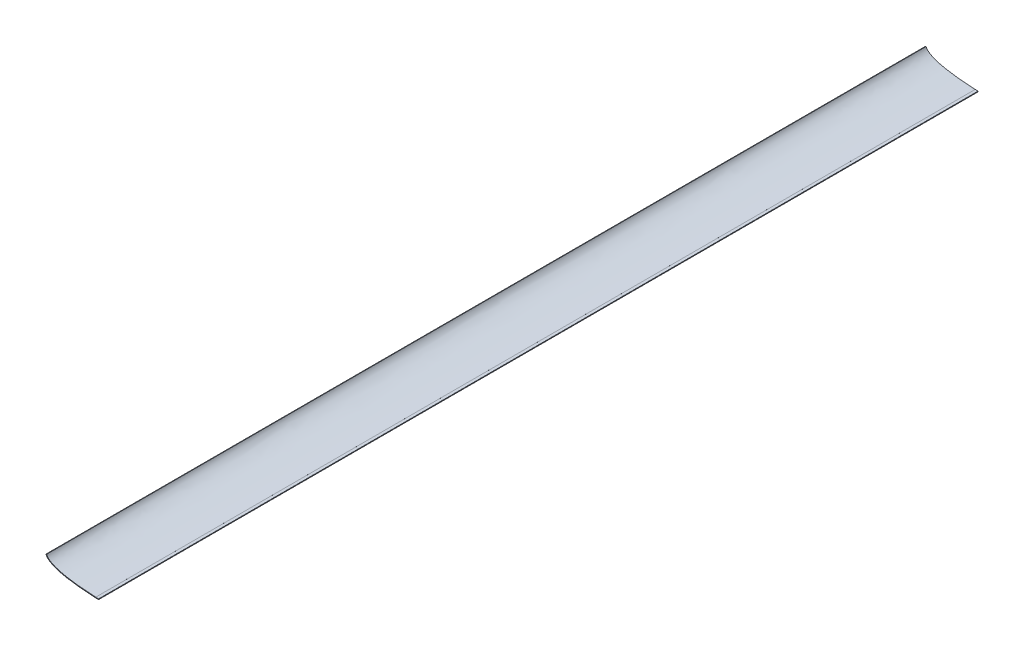
ISO-10303-21;
HEADER;
FILE_DESCRIPTION(('STEP AP214'),'2;1');
FILE_NAME('part.step','',(''),(''),'','','');
FILE_SCHEMA(('AUTOMOTIVE_DESIGN { 1 0 10303 214 1 1 1 1 }'));
ENDSEC;
DATA;
#1=APPLICATION_CONTEXT('core data for automotive mechanical design processes');
#2=APPLICATION_PROTOCOL_DEFINITION('international standard','automotive_design',2000,#1);
#3=PRODUCT_CONTEXT('',#1,'mechanical');
#4=PRODUCT('Part','Part','',(#3));
#5=PRODUCT_RELATED_PRODUCT_CATEGORY('part','',(#4));
#6=PRODUCT_DEFINITION_FORMATION('','',#4);
#7=PRODUCT_DEFINITION_CONTEXT('part definition',#1,'design');
#8=PRODUCT_DEFINITION('design','',#6,#7);
#9=PRODUCT_DEFINITION_SHAPE('','',#8);
#10=(LENGTH_UNIT() NAMED_UNIT(*) SI_UNIT(.MILLI.,.METRE.));
#11=(NAMED_UNIT(*) PLANE_ANGLE_UNIT() SI_UNIT($,.RADIAN.));
#12=(NAMED_UNIT(*) SI_UNIT($,.STERADIAN.) SOLID_ANGLE_UNIT());
#13=UNCERTAINTY_MEASURE_WITH_UNIT(LENGTH_MEASURE(1.E-05),#10,'distance_accuracy_value','');
#14=(GEOMETRIC_REPRESENTATION_CONTEXT(3) GLOBAL_UNCERTAINTY_ASSIGNED_CONTEXT((#13)) GLOBAL_UNIT_ASSIGNED_CONTEXT((#10,
#11,#12)) REPRESENTATION_CONTEXT('',''));
#15=CARTESIAN_POINT('',(0.,0.,0.));
#16=DIRECTION('',(0.,0.,1.));
#17=DIRECTION('',(1.,0.,0.));
#18=AXIS2_PLACEMENT_3D('',#15,#16,#17);
#19=CARTESIAN_POINT('',(26.901066711762,-13.11585791087,0.));
#20=DIRECTION('',(0.,0.,1.));
#21=DIRECTION('',(1.,0.,0.));
#22=AXIS2_PLACEMENT_3D('',#19,#20,#21);
#23=PLANE('',#22);
#24=CARTESIAN_POINT('',(56.8281896627183,-15.996979923149,0.));
#25=CARTESIAN_POINT('',(53.4352418951946,-15.8327666243732,0.));
#26=CARTESIAN_POINT('',(47.827179309116,-15.4960428215048,0.));
#27=CARTESIAN_POINT('',(40.0204840876464,-14.8295538969955,0.));
#28=CARTESIAN_POINT('',(33.4038481550831,-14.0959251929234,0.));
#29=CARTESIAN_POINT('',(26.8204123460112,-13.1515847277481,0.));
#30=CARTESIAN_POINT('',(20.2947429531198,-11.9223261466579,0.));
#31=CARTESIAN_POINT('',(14.9445491076174,-10.5640357120534,0.));
#32=CARTESIAN_POINT('',(10.7844340516035,-9.15547387302315,0.));
#33=CARTESIAN_POINT('',(7.7663363929576,-7.88301900907946,0.));
#34=CARTESIAN_POINT('',(4.92994728444026,-6.31128484880025,0.));
#35=CARTESIAN_POINT('',(2.44807749314516,-4.30917962920341,0.));
#36=CARTESIAN_POINT('',(1.33745783890302,-2.56838043336178,0.));
#37=CARTESIAN_POINT('',(1.0429747319706,-1.62013911102391,0.));
#38=CARTESIAN_POINT('',(1.03901578886977,-1.6072204312826,0.));
#39=B_SPLINE_CURVE_WITH_KNOTS('',3,(#24,#25,#26,#27,#28,#29,#30,#31,#32,#33,#34,#35,#36,#37,
#38),.UNSPECIFIED.,.F.,.F.,(4,1,1,1,1,1,1,1,1,1,1,1,4),(0.505092138152908,0.517594637437808,
0.525773848263812,0.533953059089816,0.54213226991582,0.550311480741824,0.558490691567828,
0.56258029698083,0.566669902393832,0.570759507806834,0.574849113219836,0.578938718632838,
0.578995146534428),.UNSPECIFIED.);
#40=CARTESIAN_POINT('',(56.8281896627183,-15.996979923149,0.));
#41=VERTEX_POINT('',#40);
#42=CARTESIAN_POINT('',(1.03901578886977,-1.6072204312826,0.));
#43=VERTEX_POINT('',#42);
#44=EDGE_CURVE('E128',#41,#43,#39,.T.);
#45=ORIENTED_EDGE('',*,*,#44,.T.);
#46=DIRECTION('',(0.956111972949269,0.293001527612154,0.));
#47=VECTOR('',#46,1.);
#48=CARTESIAN_POINT('',(0.280101910341285,-1.83979039382474,0.));
#49=LINE('',#48,#47);
#50=CARTESIAN_POINT('',(0.280101910341285,-1.83979039382474,0.));
#51=VERTEX_POINT('',#50);
#52=EDGE_CURVE('E135',#51,#43,#49,.T.);
#53=ORIENTED_EDGE('',*,*,#52,.F.);
#54=CARTESIAN_POINT('',(56.7898183340665,-16.7898019105065,0.));
#55=CARTESIAN_POINT('',(51.766773466418,-16.5466944935546,0.));
#56=CARTESIAN_POINT('',(46.7476503498991,-16.2194285761813,0.));
#57=CARTESIAN_POINT('',(39.2357092452721,-15.5326298672791,0.));
#58=CARTESIAN_POINT('',(36.7345746663049,-15.2703112761094,0.));
#59=CARTESIAN_POINT('',(31.7431822661219,-14.6582621007946,0.));
#60=CARTESIAN_POINT('',(29.2523333489485,-14.3090986336579,0.));
#61=CARTESIAN_POINT('',(24.2908656840406,-13.488857664956,0.));
#62=CARTESIAN_POINT('',(21.8197329091077,-13.0180777860044,0.));
#63=CARTESIAN_POINT('',(16.91682334248,-11.8956080347622,0.));
#64=CARTESIAN_POINT('',(14.4845557405809,-11.2433041380057,0.));
#65=CARTESIAN_POINT('',(10.9135244988008,-10.0252452596212,0.));
#66=CARTESIAN_POINT('',(9.7364023472666,-9.57864300481027,0.));
#67=CARTESIAN_POINT('',(7.4339497858248,-8.5652698916742,0.));
#68=CARTESIAN_POINT('',(6.30678685118068,-7.99998636813309,0.));
#69=CARTESIAN_POINT('',(4.69933607525968,-7.01153313153026,0.));
#70=CARTESIAN_POINT('',(4.17730914145971,-6.65905263558991,0.));
#71=CARTESIAN_POINT('',(3.17645369396348,-5.89195388211098,0.));
#72=CARTESIAN_POINT('',(2.69907744329415,-5.47751588616392,0.));
#73=CARTESIAN_POINT('',(1.82178595959564,-4.57191876992906,0.));
#74=CARTESIAN_POINT('',(1.42118699398269,-4.07988472946924,0.));
#75=CARTESIAN_POINT('',(0.743379493507723,-3.01749492012648,0.));
#76=CARTESIAN_POINT('',(0.465927735318547,-2.44617049563472,0.));
#77=CARTESIAN_POINT('',(0.280101910341281,-1.83979039382473,0.));
#78=B_SPLINE_CURVE_WITH_KNOTS('',3,(#54,#55,#56,#57,#58,#59,#60,#61,#62,#63,#64,#65,#66,#67,#68,
#69,#70,#71,#72,#73,#74,#75,#76,#77),.UNSPECIFIED.,.F.,.F.,(4,2,2,2,2,2,2,2,2,2,2,4),(0.,0.25,
0.375,0.5,0.625,0.75,0.8125,0.875,0.90625,0.9375,0.96875,1.),.UNSPECIFIED.);
#79=CARTESIAN_POINT('',(56.7898183340665,-16.7898019105065,0.));
#80=VERTEX_POINT('',#79);
#81=EDGE_CURVE('E138',#80,#51,#78,.T.);
#82=ORIENTED_EDGE('',*,*,#81,.F.);
#83=DIRECTION('',(-0.048341831372306,-0.998830850214175,0.));
#84=VECTOR('',#83,1.);
#85=CARTESIAN_POINT('',(56.8281896627183,-15.996979923149,0.));
#86=LINE('',#85,#84);
#87=EDGE_CURVE('E127',#41,#80,#86,.T.);
#88=ORIENTED_EDGE('',*,*,#87,.F.);
#89=EDGE_LOOP('',(#45,#53,#82,#88));
#90=FACE_BOUND('',#89,.T.);
#91=ADVANCED_FACE('F81',(#90),#23,.T.);
#92=CARTESIAN_POINT('',(0.280101910341285,-1.83979039382474,-1058.55080707235));
#93=DIRECTION('',(0.293001527612154,-0.956111972949269,0.));
#94=DIRECTION('',(0.956111972949269,0.293001527612154,0.));
#95=AXIS2_PLACEMENT_3D('',#92,#93,#94);
#96=PLANE('',#95);
#97=DIRECTION('',(0.,0.,1.));
#98=VECTOR('',#97,1.);
#99=CARTESIAN_POINT('',(1.03901578886977,-1.6072204312826,-1058.55080707235));
#100=LINE('',#99,#98);
#101=CARTESIAN_POINT('',(1.03901578886977,-1.6072204312826,-1000.));
#102=VERTEX_POINT('',#101);
#103=EDGE_CURVE('E121',#102,#43,#100,.T.);
#104=ORIENTED_EDGE('',*,*,#103,.F.);
#105=DIRECTION('',(-0.956111972949269,-0.293001527612154,0.));
#106=VECTOR('',#105,1.);
#107=CARTESIAN_POINT('',(0.280101910341285,-1.83979039382474,-1000.));
#108=LINE('',#107,#106);
#109=CARTESIAN_POINT('',(0.280101910341285,-1.83979039382474,-1000.));
#110=VERTEX_POINT('',#109);
#111=EDGE_CURVE('E88',#102,#110,#108,.T.);
#112=ORIENTED_EDGE('',*,*,#111,.T.);
#113=DIRECTION('',(0.,0.,1.));
#114=VECTOR('',#113,1.);
#115=CARTESIAN_POINT('',(0.280101910341285,-1.83979039382474,-1058.55080707235));
#116=LINE('',#115,#114);
#117=EDGE_CURVE('E129',#110,#51,#116,.T.);
#118=ORIENTED_EDGE('',*,*,#117,.T.);
#119=ORIENTED_EDGE('',*,*,#52,.T.);
#120=EDGE_LOOP('',(#104,#112,#118,#119));
#121=FACE_BOUND('',#120,.T.);
#122=ADVANCED_FACE('F133',(#121),#96,.F.);
#123=CARTESIAN_POINT('',(56.7898183340665,-16.7898019105065,-1058.55080707235));
#124=CARTESIAN_POINT('',(51.766773466418,-16.5466944935546,-1058.55080707235));
#125=CARTESIAN_POINT('',(46.7476503498991,-16.2194285761813,-1058.55080707235));
#126=CARTESIAN_POINT('',(39.2357092452721,-15.5326298672791,-1058.55080707235));
#127=CARTESIAN_POINT('',(36.7345746663049,-15.2703112761094,-1058.55080707235));
#128=CARTESIAN_POINT('',(31.7431822661219,-14.6582621007946,-1058.55080707235));
#129=CARTESIAN_POINT('',(29.2523333489485,-14.3090986336579,-1058.55080707235));
#130=CARTESIAN_POINT('',(24.2908656840406,-13.488857664956,-1058.55080707235));
#131=CARTESIAN_POINT('',(21.8197329091077,-13.0180777860044,-1058.55080707235));
#132=CARTESIAN_POINT('',(16.91682334248,-11.8956080347622,-1058.55080707235));
#133=CARTESIAN_POINT('',(14.4845557405809,-11.2433041380057,-1058.55080707235));
#134=CARTESIAN_POINT('',(10.9135244988008,-10.0252452596212,-1058.55080707235));
#135=CARTESIAN_POINT('',(9.7364023472666,-9.57864300481027,-1058.55080707235));
#136=CARTESIAN_POINT('',(7.4339497858248,-8.5652698916742,-1058.55080707235));
#137=CARTESIAN_POINT('',(6.30678685118068,-7.99998636813309,-1058.55080707235));
#138=CARTESIAN_POINT('',(4.69933607525968,-7.01153313153026,-1058.55080707235));
#139=CARTESIAN_POINT('',(4.17730914145971,-6.65905263558991,-1058.55080707235));
#140=CARTESIAN_POINT('',(3.17645369396348,-5.89195388211098,-1058.55080707235));
#141=CARTESIAN_POINT('',(2.69907744329415,-5.47751588616392,-1058.55080707235));
#142=CARTESIAN_POINT('',(1.82178595959564,-4.57191876992906,-1058.55080707235));
#143=CARTESIAN_POINT('',(1.42118699398269,-4.07988472946924,-1058.55080707235));
#144=CARTESIAN_POINT('',(0.743379493507723,-3.01749492012648,-1058.55080707235));
#145=CARTESIAN_POINT('',(0.465927735318547,-2.44617049563472,-1058.55080707235));
#146=CARTESIAN_POINT('',(0.280101910341281,-1.83979039382473,-1058.55080707235));
#147=B_SPLINE_CURVE_WITH_KNOTS('',3,(#123,#124,#125,#126,#127,#128,#129,#130,#131,#132,#133,
#134,#135,#136,#137,#138,#139,#140,#141,#142,#143,#144,#145,#146),.UNSPECIFIED.,.F.,.F.,(4,2,2,
2,2,2,2,2,2,2,2,4),(0.,0.25,0.375,0.5,0.625,0.75,0.8125,0.875,0.90625,0.9375,0.96875,1.),.UNSPECIFIED.);
#148=DIRECTION('',(0.,0.,1.));
#149=VECTOR('',#148,1.);
#150=SURFACE_OF_LINEAR_EXTRUSION('',#147,#149);
#151=ORIENTED_EDGE('',*,*,#117,.F.);
#152=CARTESIAN_POINT('',(56.7898183340665,-16.7898019105065,-1000.));
#153=CARTESIAN_POINT('',(51.766773466418,-16.5466944935546,-1000.));
#154=CARTESIAN_POINT('',(46.7476503498991,-16.2194285761813,-1000.));
#155=CARTESIAN_POINT('',(39.2357092452721,-15.5326298672791,-1000.));
#156=CARTESIAN_POINT('',(36.7345746663049,-15.2703112761094,-1000.));
#157=CARTESIAN_POINT('',(31.7431822661219,-14.6582621007946,-1000.));
#158=CARTESIAN_POINT('',(29.2523333489485,-14.3090986336579,-1000.));
#159=CARTESIAN_POINT('',(24.2908656840406,-13.488857664956,-1000.));
#160=CARTESIAN_POINT('',(21.8197329091077,-13.0180777860044,-1000.));
#161=CARTESIAN_POINT('',(16.91682334248,-11.8956080347622,-1000.));
#162=CARTESIAN_POINT('',(14.4845557405809,-11.2433041380057,-1000.));
#163=CARTESIAN_POINT('',(10.9135244988008,-10.0252452596212,-1000.));
#164=CARTESIAN_POINT('',(9.7364023472666,-9.57864300481027,-1000.));
#165=CARTESIAN_POINT('',(7.4339497858248,-8.5652698916742,-1000.));
#166=CARTESIAN_POINT('',(6.30678685118068,-7.99998636813309,-1000.));
#167=CARTESIAN_POINT('',(4.69933607525968,-7.01153313153026,-1000.));
#168=CARTESIAN_POINT('',(4.17730914145971,-6.65905263558991,-1000.));
#169=CARTESIAN_POINT('',(3.17645369396348,-5.89195388211098,-1000.));
#170=CARTESIAN_POINT('',(2.69907744329415,-5.47751588616392,-1000.));
#171=CARTESIAN_POINT('',(1.82178595959564,-4.57191876992906,-1000.));
#172=CARTESIAN_POINT('',(1.42118699398269,-4.07988472946924,-1000.));
#173=CARTESIAN_POINT('',(0.743379493507723,-3.01749492012648,-1000.));
#174=CARTESIAN_POINT('',(0.465927735318547,-2.44617049563472,-1000.));
#175=CARTESIAN_POINT('',(0.280101910341281,-1.83979039382473,-1000.));
#176=B_SPLINE_CURVE_WITH_KNOTS('',3,(#152,#153,#154,#155,#156,#157,#158,#159,#160,#161,#162,
#163,#164,#165,#166,#167,#168,#169,#170,#171,#172,#173,#174,#175),.UNSPECIFIED.,.F.,.F.,(4,2,2,
2,2,2,2,2,2,2,2,4),(0.,0.25,0.375,0.5,0.625,0.75,0.8125,0.875,0.90625,0.9375,0.96875,1.),.UNSPECIFIED.);
#177=CARTESIAN_POINT('',(56.7898183340665,-16.7898019105065,-1000.));
#178=VERTEX_POINT('',#177);
#179=EDGE_CURVE('E167',#110,#178,#176,.F.);
#180=ORIENTED_EDGE('',*,*,#179,.T.);
#181=DIRECTION('',(0.,0.,1.));
#182=VECTOR('',#181,1.);
#183=CARTESIAN_POINT('',(56.7898183340665,-16.7898019105065,-1058.55080707235));
#184=LINE('',#183,#182);
#185=EDGE_CURVE('E162',#178,#80,#184,.T.);
#186=ORIENTED_EDGE('',*,*,#185,.T.);
#187=ORIENTED_EDGE('',*,*,#81,.T.);
#188=EDGE_LOOP('',(#151,#180,#186,#187));
#189=FACE_BOUND('',#188,.T.);
#190=ADVANCED_FACE('F168',(#189),#150,.F.);
#191=CARTESIAN_POINT('',(56.8281896627183,-15.996979923149,-1058.55080707235));
#192=DIRECTION('',(-0.998830850214175,0.048341831372306,0.));
#193=DIRECTION('',(-0.048341831372306,-0.998830850214175,0.));
#194=AXIS2_PLACEMENT_3D('',#191,#192,#193);
#195=PLANE('',#194);
#196=ORIENTED_EDGE('',*,*,#185,.F.);
#197=DIRECTION('',(0.048341831372306,0.998830850214175,0.));
#198=VECTOR('',#197,1.);
#199=CARTESIAN_POINT('',(56.8281896627183,-15.996979923149,-1000.));
#200=LINE('',#199,#198);
#201=CARTESIAN_POINT('',(56.8281896627183,-15.996979923149,-1000.));
#202=VERTEX_POINT('',#201);
#203=EDGE_CURVE('E93',#178,#202,#200,.T.);
#204=ORIENTED_EDGE('',*,*,#203,.T.);
#205=DIRECTION('',(0.,0.,1.));
#206=VECTOR('',#205,1.);
#207=CARTESIAN_POINT('',(56.8281896627183,-15.996979923149,-1058.55080707235));
#208=LINE('',#207,#206);
#209=EDGE_CURVE('E158',#202,#41,#208,.T.);
#210=ORIENTED_EDGE('',*,*,#209,.T.);
#211=ORIENTED_EDGE('',*,*,#87,.T.);
#212=EDGE_LOOP('',(#196,#204,#210,#211));
#213=FACE_BOUND('',#212,.T.);
#214=ADVANCED_FACE('F170',(#213),#195,.F.);
#215=CARTESIAN_POINT('',(56.8281896627183,-15.996979923149,-1058.55080707235));
#216=CARTESIAN_POINT('',(53.4352418951946,-15.8327666243732,-1058.55080707235));
#217=CARTESIAN_POINT('',(47.827179309116,-15.4960428215048,-1058.55080707235));
#218=CARTESIAN_POINT('',(40.0204840876464,-14.8295538969955,-1058.55080707235));
#219=CARTESIAN_POINT('',(33.4038481550831,-14.0959251929234,-1058.55080707235));
#220=CARTESIAN_POINT('',(26.8204123460112,-13.1515847277481,-1058.55080707235));
#221=CARTESIAN_POINT('',(20.2947429531198,-11.9223261466579,-1058.55080707235));
#222=CARTESIAN_POINT('',(14.9445491076174,-10.5640357120534,-1058.55080707235));
#223=CARTESIAN_POINT('',(10.7844340516035,-9.15547387302315,-1058.55080707235));
#224=CARTESIAN_POINT('',(7.7663363929576,-7.88301900907946,-1058.55080707235));
#225=CARTESIAN_POINT('',(4.92994728444026,-6.31128484880025,-1058.55080707235));
#226=CARTESIAN_POINT('',(2.44807749314516,-4.30917962920341,-1058.55080707235));
#227=CARTESIAN_POINT('',(1.33745783890302,-2.56838043336178,-1058.55080707235));
#228=CARTESIAN_POINT('',(1.0429747319706,-1.62013911102391,-1058.55080707235));
#229=CARTESIAN_POINT('',(1.03901578886977,-1.6072204312826,-1058.55080707235));
#230=B_SPLINE_CURVE_WITH_KNOTS('',3,(#215,#216,#217,#218,#219,#220,#221,#222,#223,#224,#225,
#226,#227,#228,#229),.UNSPECIFIED.,.F.,.F.,(4,1,1,1,1,1,1,1,1,1,1,1,4),(0.505092138152908,
0.517594637437808,0.525773848263812,0.533953059089816,0.54213226991582,0.550311480741824,
0.558490691567828,0.56258029698083,0.566669902393832,0.570759507806834,0.574849113219836,
0.578938718632838,0.578995146534428),.UNSPECIFIED.);
#231=DIRECTION('',(0.,0.,1.));
#232=VECTOR('',#231,1.);
#233=SURFACE_OF_LINEAR_EXTRUSION('',#230,#232);
#234=CARTESIAN_POINT('',(56.8281896627183,-15.996979923149,-1000.));
#235=CARTESIAN_POINT('',(53.4352418951946,-15.8327666243732,-1000.));
#236=CARTESIAN_POINT('',(47.827179309116,-15.4960428215048,-1000.));
#237=CARTESIAN_POINT('',(40.0204840876464,-14.8295538969955,-1000.));
#238=CARTESIAN_POINT('',(33.4038481550831,-14.0959251929234,-1000.));
#239=CARTESIAN_POINT('',(26.8204123460112,-13.1515847277481,-1000.));
#240=CARTESIAN_POINT('',(20.2947429531198,-11.9223261466579,-1000.));
#241=CARTESIAN_POINT('',(14.9445491076174,-10.5640357120534,-1000.));
#242=CARTESIAN_POINT('',(10.7844340516035,-9.15547387302315,-1000.));
#243=CARTESIAN_POINT('',(7.7663363929576,-7.88301900907946,-1000.));
#244=CARTESIAN_POINT('',(4.92994728444026,-6.31128484880025,-1000.));
#245=CARTESIAN_POINT('',(2.44807749314516,-4.30917962920341,-1000.));
#246=CARTESIAN_POINT('',(1.33745783890302,-2.56838043336178,-1000.));
#247=CARTESIAN_POINT('',(1.0429747319706,-1.62013911102391,-1000.));
#248=CARTESIAN_POINT('',(1.03901578886977,-1.6072204312826,-1000.));
#249=B_SPLINE_CURVE_WITH_KNOTS('',3,(#234,#235,#236,#237,#238,#239,#240,#241,#242,#243,#244,
#245,#246,#247,#248),.UNSPECIFIED.,.F.,.F.,(4,1,1,1,1,1,1,1,1,1,1,1,4),(0.505092138152908,
0.517594637437808,0.525773848263812,0.533953059089816,0.54213226991582,0.550311480741824,
0.558490691567828,0.56258029698083,0.566669902393832,0.570759507806834,0.574849113219836,
0.578938718632838,0.578995146534428),.UNSPECIFIED.);
#250=EDGE_CURVE('E13',#102,#202,#249,.F.);
#251=ORIENTED_EDGE('',*,*,#250,.F.);
#252=ORIENTED_EDGE('',*,*,#103,.T.);
#253=ORIENTED_EDGE('',*,*,#44,.F.);
#254=ORIENTED_EDGE('',*,*,#209,.F.);
#255=EDGE_LOOP('',(#251,#252,#253,#254));
#256=FACE_BOUND('',#255,.T.);
#257=ADVANCED_FACE('F82',(#256),#233,.T.);
#258=CARTESIAN_POINT('',(0.406397821987738,0.00933734423304473,-1000.));
#259=DIRECTION('',(0.,0.,1.));
#260=DIRECTION('',(-0.710041561326326,0.70415976964697,0.));
#261=AXIS2_PLACEMENT_3D('',#258,#259,#260);
#262=PLANE('',#261);
#263=ORIENTED_EDGE('',*,*,#250,.T.);
#264=ORIENTED_EDGE('',*,*,#203,.F.);
#265=ORIENTED_EDGE('',*,*,#179,.F.);
#266=ORIENTED_EDGE('',*,*,#111,.F.);
#267=EDGE_LOOP('',(#263,#264,#265,#266));
#268=FACE_BOUND('',#267,.T.);
#269=ADVANCED_FACE('F187',(#268),#262,.F.);
#270=CLOSED_SHELL('',(#91,#122,#190,#214,#257,#269));
#271=MANIFOLD_SOLID_BREP('B2',#270);
#272=CARTESIAN_POINT('',(0.,0.,0.));
#273=DIRECTION('',(0.,0.,-1.));
#274=DIRECTION('',(-1.,0.,0.));
#275=AXIS2_PLACEMENT_3D('',#272,#273,#274);
#276=PLANE('',#275);
#277=DIRECTION('',(-0.999069581595064,0.04312738261783,0.));
#278=VECTOR('',#277,1.);
#279=CARTESIAN_POINT('',(60.,-16.1393668026756,0.));
#280=LINE('',#279,#278);
#281=CARTESIAN_POINT('',(60.,-16.1393668026756,0.));
#282=VERTEX_POINT('',#281);
#283=CARTESIAN_POINT('',(56.8279540784845,-16.0024373628661,0.));
#284=VERTEX_POINT('',#283);
#285=EDGE_CURVE('E284',#282,#284,#280,.T.);
#286=ORIENTED_EDGE('',*,*,#285,.T.);
#287=DIRECTION('',(0.0431273826178305,0.999069581595064,0.));
#288=VECTOR('',#287,1.);
#289=CARTESIAN_POINT('',(56.7937217185316,-16.7954488432572,0.));
#290=LINE('',#289,#288);
#291=CARTESIAN_POINT('',(56.7937217185316,-16.7954488432572,0.));
#292=VERTEX_POINT('',#291);
#293=EDGE_CURVE('E288',#292,#284,#290,.T.);
#294=ORIENTED_EDGE('',*,*,#293,.F.);
#295=DIRECTION('',(-0.999069581595064,0.04312738261783,0.));
#296=VECTOR('',#295,1.);
#297=CARTESIAN_POINT('',(59.9657676400471,-16.9323782830667,0.));
#298=LINE('',#297,#296);
#299=CARTESIAN_POINT('',(59.9657676400471,-16.9323782830667,0.));
#300=VERTEX_POINT('',#299);
#301=EDGE_CURVE('E293',#300,#292,#298,.T.);
#302=ORIENTED_EDGE('',*,*,#301,.F.);
#303=DIRECTION('',(-0.0431273826178305,-0.999069581595064,0.));
#304=VECTOR('',#303,1.);
#305=CARTESIAN_POINT('',(60.,-16.1393668026756,0.));
#306=LINE('',#305,#304);
#307=EDGE_CURVE('E287',#282,#300,#306,.T.);
#308=ORIENTED_EDGE('',*,*,#307,.F.);
#309=EDGE_LOOP('',(#286,#294,#302,#308));
#310=FACE_BOUND('',#309,.T.);
#311=ADVANCED_FACE('F241',(#310),#276,.F.);
#312=CARTESIAN_POINT('',(56.7937217185316,-16.7954488432572,-1058.55080707235));
#313=DIRECTION('',(0.999069581595063,-0.0431273826178305,0.));
#314=DIRECTION('',(0.0431273826178305,0.999069581595064,0.));
#315=AXIS2_PLACEMENT_3D('',#312,#313,#314);
#316=PLANE('',#315);
#317=DIRECTION('',(0.,0.,1.));
#318=VECTOR('',#317,1.);
#319=CARTESIAN_POINT('',(56.8279540784845,-16.0024373628661,-1058.55080707235));
#320=LINE('',#319,#318);
#321=CARTESIAN_POINT('',(56.8279540784845,-16.0024373628661,-1000.));
#322=VERTEX_POINT('',#321);
#323=EDGE_CURVE('E279',#322,#284,#320,.T.);
#324=ORIENTED_EDGE('',*,*,#323,.F.);
#325=DIRECTION('',(-0.0431273826178305,-0.999069581595064,0.));
#326=VECTOR('',#325,1.);
#327=CARTESIAN_POINT('',(56.7937217185316,-16.7954488432572,-1000.));
#328=LINE('',#327,#326);
#329=CARTESIAN_POINT('',(56.7937217185316,-16.7954488432572,-1000.));
#330=VERTEX_POINT('',#329);
#331=EDGE_CURVE('E245',#322,#330,#328,.T.);
#332=ORIENTED_EDGE('',*,*,#331,.T.);
#333=DIRECTION('',(0.,0.,1.));
#334=VECTOR('',#333,1.);
#335=CARTESIAN_POINT('',(56.7937217185316,-16.7954488432572,-1058.55080707235));
#336=LINE('',#335,#334);
#337=EDGE_CURVE('E286',#330,#292,#336,.T.);
#338=ORIENTED_EDGE('',*,*,#337,.T.);
#339=ORIENTED_EDGE('',*,*,#293,.T.);
#340=EDGE_LOOP('',(#324,#332,#338,#339));
#341=FACE_BOUND('',#340,.T.);
#342=ADVANCED_FACE('F290',(#341),#316,.F.);
#343=CARTESIAN_POINT('',(59.9657676400471,-16.9323782830667,-1058.55080707235));
#344=DIRECTION('',(0.04312738261783,0.999069581595063,0.));
#345=DIRECTION('',(-0.999069581595064,0.04312738261783,0.));
#346=AXIS2_PLACEMENT_3D('',#343,#344,#345);
#347=PLANE('',#346);
#348=ORIENTED_EDGE('',*,*,#337,.F.);
#349=DIRECTION('',(0.999069581595064,-0.04312738261783,0.));
#350=VECTOR('',#349,1.);
#351=CARTESIAN_POINT('',(59.9657676400471,-16.9323782830667,-1000.));
#352=LINE('',#351,#350);
#353=CARTESIAN_POINT('',(59.9657676400471,-16.9323782830667,-1000.));
#354=VERTEX_POINT('',#353);
#355=EDGE_CURVE('E311',#330,#354,#352,.T.);
#356=ORIENTED_EDGE('',*,*,#355,.T.);
#357=DIRECTION('',(0.,0.,1.));
#358=VECTOR('',#357,1.);
#359=CARTESIAN_POINT('',(59.9657676400471,-16.9323782830667,-1058.55080707235));
#360=LINE('',#359,#358);
#361=EDGE_CURVE('E308',#354,#300,#360,.T.);
#362=ORIENTED_EDGE('',*,*,#361,.T.);
#363=ORIENTED_EDGE('',*,*,#301,.T.);
#364=EDGE_LOOP('',(#348,#356,#362,#363));
#365=FACE_BOUND('',#364,.T.);
#366=ADVANCED_FACE('F307',(#365),#347,.F.);
#367=CARTESIAN_POINT('',(60.,-16.1393668026756,-1058.55080707235));
#368=DIRECTION('',(-0.999069581595063,0.0431273826178305,0.));
#369=DIRECTION('',(-0.0431273826178305,-0.999069581595064,0.));
#370=AXIS2_PLACEMENT_3D('',#367,#368,#369);
#371=PLANE('',#370);
#372=ORIENTED_EDGE('',*,*,#361,.F.);
#373=DIRECTION('',(0.0431273826178305,0.999069581595064,0.));
#374=VECTOR('',#373,1.);
#375=CARTESIAN_POINT('',(60.,-16.1393668026756,-1000.));
#376=LINE('',#375,#374);
#377=CARTESIAN_POINT('',(60.,-16.1393668026756,-1000.));
#378=VERTEX_POINT('',#377);
#379=EDGE_CURVE('E248',#354,#378,#376,.T.);
#380=ORIENTED_EDGE('',*,*,#379,.T.);
#381=DIRECTION('',(0.,0.,1.));
#382=VECTOR('',#381,1.);
#383=CARTESIAN_POINT('',(60.,-16.1393668026756,-1058.55080707235));
#384=LINE('',#383,#382);
#385=EDGE_CURVE('E305',#378,#282,#384,.T.);
#386=ORIENTED_EDGE('',*,*,#385,.T.);
#387=ORIENTED_EDGE('',*,*,#307,.T.);
#388=EDGE_LOOP('',(#372,#380,#386,#387));
#389=FACE_BOUND('',#388,.T.);
#390=ADVANCED_FACE('F313',(#389),#371,.F.);
#391=CARTESIAN_POINT('',(60.,-16.1393668026756,-1058.55080707235));
#392=DIRECTION('',(0.04312738261783,0.999069581595063,0.));
#393=DIRECTION('',(-0.999069581595064,0.04312738261783,0.));
#394=AXIS2_PLACEMENT_3D('',#391,#392,#393);
#395=PLANE('',#394);
#396=DIRECTION('',(0.999069581595064,-0.04312738261783,0.));
#397=VECTOR('',#396,1.);
#398=CARTESIAN_POINT('',(60.,-16.1393668026756,-1000.));
#399=LINE('',#398,#397);
#400=EDGE_CURVE('E83',#322,#378,#399,.T.);
#401=ORIENTED_EDGE('',*,*,#400,.F.);
#402=ORIENTED_EDGE('',*,*,#323,.T.);
#403=ORIENTED_EDGE('',*,*,#285,.F.);
#404=ORIENTED_EDGE('',*,*,#385,.F.);
#405=EDGE_LOOP('',(#401,#402,#403,#404));
#406=FACE_BOUND('',#405,.T.);
#407=ADVANCED_FACE('F244',(#406),#395,.T.);
#408=CARTESIAN_POINT('',(0.406397821987738,0.00933734423304473,-1000.));
#409=DIRECTION('',(0.,0.,1.));
#410=DIRECTION('',(-0.710041561326326,0.70415976964697,0.));
#411=AXIS2_PLACEMENT_3D('',#408,#409,#410);
#412=PLANE('',#411);
#413=ORIENTED_EDGE('',*,*,#400,.T.);
#414=ORIENTED_EDGE('',*,*,#379,.F.);
#415=ORIENTED_EDGE('',*,*,#355,.F.);
#416=ORIENTED_EDGE('',*,*,#331,.F.);
#417=EDGE_LOOP('',(#413,#414,#415,#416));
#418=FACE_BOUND('',#417,.T.);
#419=ADVANCED_FACE('F314',(#418),#412,.F.);
#420=CLOSED_SHELL('',(#311,#342,#366,#390,#407,#419));
#421=MANIFOLD_SOLID_BREP('B7',#420);
#422=ADVANCED_BREP_SHAPE_REPRESENTATION('',(#18,#271,#421),#14);
#423=SHAPE_DEFINITION_REPRESENTATION(#9,#422);
ENDSEC;
END-ISO-10303-21;
